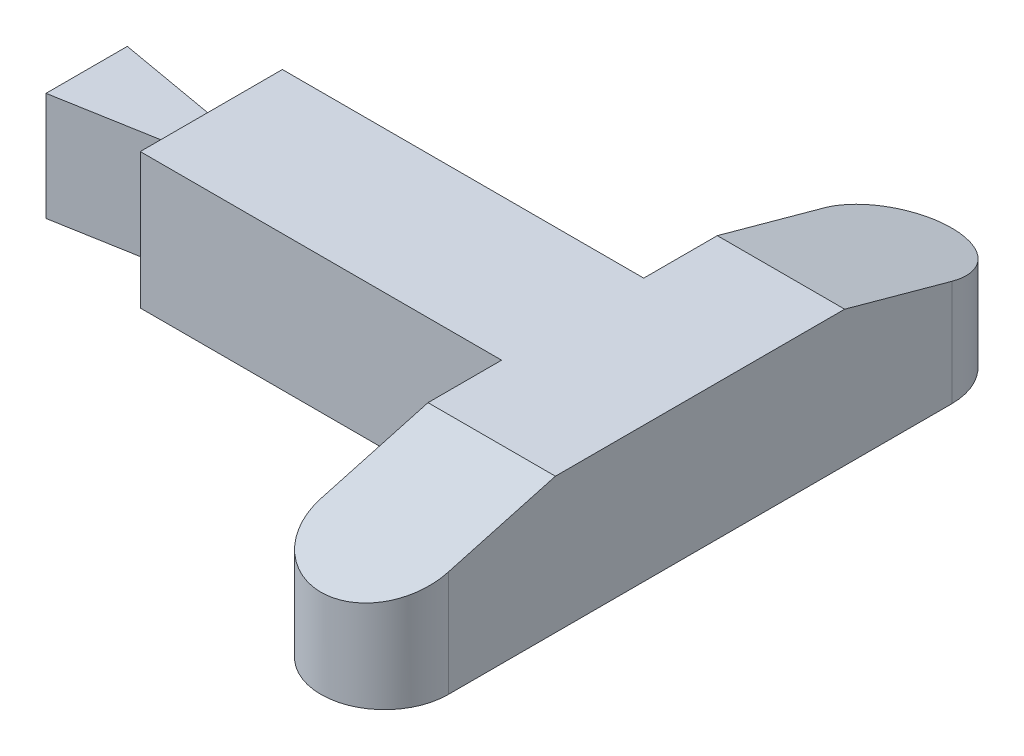
ISO-10303-21;
HEADER;
FILE_DESCRIPTION(('STEP AP214'),'2;1');
FILE_NAME('part.step','',(''),(''),'','','');
FILE_SCHEMA(('AUTOMOTIVE_DESIGN { 1 0 10303 214 1 1 1 1 }'));
ENDSEC;
DATA;
#1=APPLICATION_CONTEXT('core data for automotive mechanical design processes');
#2=APPLICATION_PROTOCOL_DEFINITION('international standard','automotive_design',2000,#1);
#3=PRODUCT_CONTEXT('',#1,'mechanical');
#4=PRODUCT('Part','Part','',(#3));
#5=PRODUCT_RELATED_PRODUCT_CATEGORY('part','',(#4));
#6=PRODUCT_DEFINITION_FORMATION('','',#4);
#7=PRODUCT_DEFINITION_CONTEXT('part definition',#1,'design');
#8=PRODUCT_DEFINITION('design','',#6,#7);
#9=PRODUCT_DEFINITION_SHAPE('','',#8);
#10=(LENGTH_UNIT() NAMED_UNIT(*) SI_UNIT(.MILLI.,.METRE.));
#11=(NAMED_UNIT(*) PLANE_ANGLE_UNIT() SI_UNIT($,.RADIAN.));
#12=(NAMED_UNIT(*) SI_UNIT($,.STERADIAN.) SOLID_ANGLE_UNIT());
#13=UNCERTAINTY_MEASURE_WITH_UNIT(LENGTH_MEASURE(1.E-05),#10,'distance_accuracy_value','');
#14=(GEOMETRIC_REPRESENTATION_CONTEXT(3) GLOBAL_UNCERTAINTY_ASSIGNED_CONTEXT((#13)) GLOBAL_UNIT_ASSIGNED_CONTEXT((#10,
#11,#12)) REPRESENTATION_CONTEXT('',''));
#15=CARTESIAN_POINT('',(0.,0.,0.));
#16=DIRECTION('',(0.,0.,1.));
#17=DIRECTION('',(1.,0.,0.));
#18=AXIS2_PLACEMENT_3D('',#15,#16,#17);
#19=CARTESIAN_POINT('',(136.652,38.1,-19.981386672207));
#20=DIRECTION('',(1.,0.,0.));
#21=DIRECTION('',(0.,0.,-1.));
#22=AXIS2_PLACEMENT_3D('',#19,#20,#21);
#23=PLANE('',#22);
#24=DIRECTION('',(0.,0.264986434589111,0.964252139994385));
#25=VECTOR('',#24,1.);
#26=CARTESIAN_POINT('',(136.652,38.1000000000001,-40.6688190452152));
#27=LINE('',#26,#25);
#28=CARTESIAN_POINT('',(136.652,29.8247557969159,-70.781386672207));
#29=VERTEX_POINT('',#28);
#30=CARTESIAN_POINT('',(136.652,38.1,-40.6688190452153));
#31=VERTEX_POINT('',#30);
#32=EDGE_CURVE('E317',#29,#31,#27,.T.);
#33=ORIENTED_EDGE('',*,*,#32,.F.);
#34=DIRECTION('',(0.,-1.,0.));
#35=VECTOR('',#34,1.);
#36=CARTESIAN_POINT('',(136.652,38.1,-70.781386672207));
#37=LINE('',#36,#35);
#38=CARTESIAN_POINT('',(136.652,0.,-70.781386672207));
#39=VERTEX_POINT('',#38);
#40=EDGE_CURVE('E253',#29,#39,#37,.T.);
#41=ORIENTED_EDGE('',*,*,#40,.T.);
#42=DIRECTION('',(0.,0.,1.));
#43=VECTOR('',#42,1.);
#44=CARTESIAN_POINT('',(136.652,0.,-19.981386672207));
#45=LINE('',#44,#43);
#46=CARTESIAN_POINT('',(136.652,0.,-19.981386672207));
#47=VERTEX_POINT('',#46);
#48=EDGE_CURVE('E233',#39,#47,#45,.T.);
#49=ORIENTED_EDGE('',*,*,#48,.T.);
#50=DIRECTION('',(0.,-1.,0.));
#51=VECTOR('',#50,1.);
#52=CARTESIAN_POINT('',(136.652,38.1,-19.981386672207));
#53=LINE('',#52,#51);
#54=CARTESIAN_POINT('',(136.652,38.1,-19.981386672207));
#55=VERTEX_POINT('',#54);
#56=EDGE_CURVE('E249',#55,#47,#53,.T.);
#57=ORIENTED_EDGE('',*,*,#56,.F.);
#58=DIRECTION('',(0.,0.,1.));
#59=VECTOR('',#58,1.);
#60=CARTESIAN_POINT('',(136.652,38.1,-19.981386672207));
#61=LINE('',#60,#59);
#62=EDGE_CURVE('E299',#31,#55,#61,.T.);
#63=ORIENTED_EDGE('',*,*,#62,.F.);
#64=EDGE_LOOP('',(#33,#41,#49,#57,#63));
#65=FACE_BOUND('',#64,.T.);
#66=ADVANCED_FACE('F45',(#65),#23,.F.);
#67=CARTESIAN_POINT('',(154.559,38.1,-70.781386672207));
#68=DIRECTION('',(0.,1.,0.));
#69=DIRECTION('',(0.,0.,1.));
#70=AXIS2_PLACEMENT_3D('',#67,#68,#69);
#71=PLANE('',#70);
#72=DIRECTION('',(-1.,0.,0.));
#73=VECTOR('',#72,1.);
#74=CARTESIAN_POINT('',(35.052,38.1,-19.981386672207));
#75=LINE('',#74,#73);
#76=CARTESIAN_POINT('',(35.052,38.1,-19.981386672207));
#77=VERTEX_POINT('',#76);
#78=EDGE_CURVE('E206',#55,#77,#75,.T.);
#79=ORIENTED_EDGE('',*,*,#78,.T.);
#80=DIRECTION('',(0.,0.,1.));
#81=VECTOR('',#80,1.);
#82=CARTESIAN_POINT('',(35.052,38.1,5.24938667220698));
#83=LINE('',#82,#81);
#84=CARTESIAN_POINT('',(35.052,38.1,19.981386672207));
#85=VERTEX_POINT('',#84);
#86=EDGE_CURVE('E242',#77,#85,#83,.T.);
#87=ORIENTED_EDGE('',*,*,#86,.T.);
#88=DIRECTION('',(1.,0.,0.));
#89=VECTOR('',#88,1.);
#90=CARTESIAN_POINT('',(35.052,38.1,19.981386672207));
#91=LINE('',#90,#89);
#92=CARTESIAN_POINT('',(136.652,38.1,19.981386672207));
#93=VERTEX_POINT('',#92);
#94=EDGE_CURVE('E293',#85,#93,#91,.T.);
#95=ORIENTED_EDGE('',*,*,#94,.T.);
#96=DIRECTION('',(0.,0.,1.));
#97=VECTOR('',#96,1.);
#98=CARTESIAN_POINT('',(136.652,38.1,19.981386672207));
#99=LINE('',#98,#97);
#100=CARTESIAN_POINT('',(136.652,38.1,40.6688190452152));
#101=VERTEX_POINT('',#100);
#102=EDGE_CURVE('E275',#93,#101,#99,.T.);
#103=ORIENTED_EDGE('',*,*,#102,.T.);
#104=DIRECTION('',(1.,0.,0.));
#105=VECTOR('',#104,1.);
#106=CARTESIAN_POINT('',(136.652,38.1,40.6688190452152));
#107=LINE('',#106,#105);
#108=CARTESIAN_POINT('',(172.466,38.1,40.6688190452151));
#109=VERTEX_POINT('',#108);
#110=EDGE_CURVE('E203',#101,#109,#107,.T.);
#111=ORIENTED_EDGE('',*,*,#110,.T.);
#112=DIRECTION('',(0.,0.,-1.));
#113=VECTOR('',#112,1.);
#114=CARTESIAN_POINT('',(172.466,38.1,-70.781386672207));
#115=LINE('',#114,#113);
#116=CARTESIAN_POINT('',(172.466,38.1,-40.6688190452154));
#117=VERTEX_POINT('',#116);
#118=EDGE_CURVE('E295',#109,#117,#115,.T.);
#119=ORIENTED_EDGE('',*,*,#118,.T.);
#120=DIRECTION('',(-1.,0.,0.));
#121=VECTOR('',#120,1.);
#122=CARTESIAN_POINT('',(530.129875813133,38.1,-40.6688190452154));
#123=LINE('',#122,#121);
#124=EDGE_CURVE('E61',#117,#31,#123,.T.);
#125=ORIENTED_EDGE('',*,*,#124,.T.);
#126=ORIENTED_EDGE('',*,*,#62,.T.);
#127=EDGE_LOOP('',(#79,#87,#95,#103,#111,#119,#125,#126));
#128=FACE_BOUND('',#127,.T.);
#129=ADVANCED_FACE('F292',(#128),#71,.T.);
#130=CARTESIAN_POINT('',(154.559,38.1,-70.781386672207));
#131=DIRECTION('',(0.,-1.,0.));
#132=DIRECTION('',(0.,0.,-1.));
#133=AXIS2_PLACEMENT_3D('',#130,#131,#132);
#134=CYLINDRICAL_SURFACE('',#133,17.907);
#135=ORIENTED_EDGE('',*,*,#40,.F.);
#136=CARTESIAN_POINT('',(154.559,29.8247557969159,-70.781386672207));
#137=DIRECTION('',(0.,0.964252139994385,-0.264986434589111));
#138=DIRECTION('',(0.,-0.264986434589111,-0.964252139994385));
#139=AXIS2_PLACEMENT_3D('',#136,#137,#138);
#140=ELLIPSE('',#139,18.570868818714,17.907);
#141=CARTESIAN_POINT('',(172.466,29.8247557969159,-70.781386672207));
#142=VERTEX_POINT('',#141);
#143=EDGE_CURVE('E11',#142,#29,#140,.T.);
#144=ORIENTED_EDGE('',*,*,#143,.F.);
#145=DIRECTION('',(0.,-1.,0.));
#146=VECTOR('',#145,1.);
#147=CARTESIAN_POINT('',(172.466,38.1,-70.781386672207));
#148=LINE('',#147,#146);
#149=CARTESIAN_POINT('',(172.466,0.,-70.781386672207));
#150=VERTEX_POINT('',#149);
#151=EDGE_CURVE('E256',#142,#150,#148,.T.);
#152=ORIENTED_EDGE('',*,*,#151,.T.);
#153=CARTESIAN_POINT('',(154.559,0.,-70.781386672207));
#154=DIRECTION('',(0.,1.,0.));
#155=DIRECTION('',(0.,0.,1.));
#156=AXIS2_PLACEMENT_3D('',#153,#154,#155);
#157=CIRCLE('',#156,17.907);
#158=EDGE_CURVE('E229',#150,#39,#157,.T.);
#159=ORIENTED_EDGE('',*,*,#158,.T.);
#160=EDGE_LOOP('',(#135,#144,#152,#159));
#161=FACE_BOUND('',#160,.T.);
#162=ADVANCED_FACE('F319',(#161),#134,.T.);
#163=CARTESIAN_POINT('',(136.652,38.1,19.981386672207));
#164=DIRECTION('',(1.,0.,0.));
#165=DIRECTION('',(0.,0.,-1.));
#166=AXIS2_PLACEMENT_3D('',#163,#164,#165);
#167=PLANE('',#166);
#168=DIRECTION('',(0.,-0.264986434589112,0.964252139994385));
#169=VECTOR('',#168,1.);
#170=CARTESIAN_POINT('',(136.652,38.1,40.6688190452152));
#171=LINE('',#170,#169);
#172=CARTESIAN_POINT('',(136.652,29.8247557969158,70.781386672207));
#173=VERTEX_POINT('',#172);
#174=EDGE_CURVE('E285',#101,#173,#171,.T.);
#175=ORIENTED_EDGE('',*,*,#174,.F.);
#176=ORIENTED_EDGE('',*,*,#102,.F.);
#177=DIRECTION('',(0.,-1.,0.));
#178=VECTOR('',#177,1.);
#179=CARTESIAN_POINT('',(136.652,38.1,19.981386672207));
#180=LINE('',#179,#178);
#181=CARTESIAN_POINT('',(136.652,0.,19.981386672207));
#182=VERTEX_POINT('',#181);
#183=EDGE_CURVE('E180',#93,#182,#180,.T.);
#184=ORIENTED_EDGE('',*,*,#183,.T.);
#185=DIRECTION('',(0.,0.,1.));
#186=VECTOR('',#185,1.);
#187=CARTESIAN_POINT('',(136.652,0.,19.981386672207));
#188=LINE('',#187,#186);
#189=CARTESIAN_POINT('',(136.652,0.,70.781386672207));
#190=VERTEX_POINT('',#189);
#191=EDGE_CURVE('E217',#182,#190,#188,.T.);
#192=ORIENTED_EDGE('',*,*,#191,.T.);
#193=DIRECTION('',(0.,-1.,0.));
#194=VECTOR('',#193,1.);
#195=CARTESIAN_POINT('',(136.652,38.1,70.781386672207));
#196=LINE('',#195,#194);
#197=EDGE_CURVE('E262',#173,#190,#196,.T.);
#198=ORIENTED_EDGE('',*,*,#197,.F.);
#199=EDGE_LOOP('',(#175,#176,#184,#192,#198));
#200=FACE_BOUND('',#199,.T.);
#201=ADVANCED_FACE('F271',(#200),#167,.F.);
#202=CARTESIAN_POINT('',(154.559,38.1,70.781386672207));
#203=DIRECTION('',(0.,-1.,0.));
#204=DIRECTION('',(0.,0.,-1.));
#205=AXIS2_PLACEMENT_3D('',#202,#203,#204);
#206=CYLINDRICAL_SURFACE('',#205,17.907);
#207=CARTESIAN_POINT('',(154.559,29.8247557969158,70.781386672207));
#208=DIRECTION('',(0.,0.964252139994385,0.264986434589112));
#209=DIRECTION('',(0.,-0.264986434589112,0.964252139994385));
#210=AXIS2_PLACEMENT_3D('',#207,#208,#209);
#211=ELLIPSE('',#210,18.5708688187141,17.907);
#212=CARTESIAN_POINT('',(172.466,29.8247557969158,70.781386672207));
#213=VERTEX_POINT('',#212);
#214=EDGE_CURVE('E200',#173,#213,#211,.T.);
#215=ORIENTED_EDGE('',*,*,#214,.F.);
#216=ORIENTED_EDGE('',*,*,#197,.T.);
#217=CARTESIAN_POINT('',(154.559,0.,70.781386672207));
#218=DIRECTION('',(0.,1.,0.));
#219=DIRECTION('',(0.,0.,-1.));
#220=AXIS2_PLACEMENT_3D('',#217,#218,#219);
#221=CIRCLE('',#220,17.907);
#222=CARTESIAN_POINT('',(172.466,0.,70.781386672207));
#223=VERTEX_POINT('',#222);
#224=EDGE_CURVE('E221',#190,#223,#221,.T.);
#225=ORIENTED_EDGE('',*,*,#224,.T.);
#226=DIRECTION('',(0.,-1.,0.));
#227=VECTOR('',#226,1.);
#228=CARTESIAN_POINT('',(172.466,38.1,70.781386672207));
#229=LINE('',#228,#227);
#230=EDGE_CURVE('E259',#213,#223,#229,.T.);
#231=ORIENTED_EDGE('',*,*,#230,.F.);
#232=EDGE_LOOP('',(#215,#216,#225,#231));
#233=FACE_BOUND('',#232,.T.);
#234=ADVANCED_FACE('F283',(#233),#206,.T.);
#235=CARTESIAN_POINT('',(172.466,38.1,-70.781386672207));
#236=DIRECTION('',(-1.,0.,0.));
#237=DIRECTION('',(0.,0.,1.));
#238=AXIS2_PLACEMENT_3D('',#235,#236,#237);
#239=PLANE('',#238);
#240=ORIENTED_EDGE('',*,*,#151,.F.);
#241=DIRECTION('',(0.,0.264986434589111,0.964252139994385));
#242=VECTOR('',#241,1.);
#243=CARTESIAN_POINT('',(172.466,38.1,-40.6688190452152));
#244=LINE('',#243,#242);
#245=EDGE_CURVE('E69',#142,#117,#244,.T.);
#246=ORIENTED_EDGE('',*,*,#245,.T.);
#247=ORIENTED_EDGE('',*,*,#118,.F.);
#248=DIRECTION('',(0.,-0.264986434589112,0.964252139994385));
#249=VECTOR('',#248,1.);
#250=CARTESIAN_POINT('',(172.466,38.1,40.6688190452152));
#251=LINE('',#250,#249);
#252=EDGE_CURVE('E288',#109,#213,#251,.T.);
#253=ORIENTED_EDGE('',*,*,#252,.T.);
#254=ORIENTED_EDGE('',*,*,#230,.T.);
#255=DIRECTION('',(0.,0.,-1.));
#256=VECTOR('',#255,1.);
#257=CARTESIAN_POINT('',(172.466,0.,-70.781386672207));
#258=LINE('',#257,#256);
#259=EDGE_CURVE('E225',#223,#150,#258,.T.);
#260=ORIENTED_EDGE('',*,*,#259,.T.);
#261=EDGE_LOOP('',(#240,#246,#247,#253,#254,#260));
#262=FACE_BOUND('',#261,.T.);
#263=ADVANCED_FACE('F320',(#262),#239,.F.);
#264=CARTESIAN_POINT('',(0.,38.1,-11.43));
#265=DIRECTION('',(-0.173648177666928,0.,0.984807753012209));
#266=DIRECTION('',(0.984807753012209,0.,0.173648177666928));
#267=AXIS2_PLACEMENT_3D('',#264,#265,#266);
#268=PLANE('',#267);
#269=DIRECTION('',(0.,-1.,0.));
#270=VECTOR('',#269,1.);
#271=CARTESIAN_POINT('',(0.,38.1,-11.43));
#272=LINE('',#271,#270);
#273=CARTESIAN_POINT('',(0.,30.48,-11.43));
#274=VERTEX_POINT('',#273);
#275=CARTESIAN_POINT('',(0.,0.,-11.43));
#276=VERTEX_POINT('',#275);
#277=EDGE_CURVE('E54',#274,#276,#272,.T.);
#278=ORIENTED_EDGE('',*,*,#277,.F.);
#279=DIRECTION('',(0.984807753012209,0.,0.173648177666928));
#280=VECTOR('',#279,1.);
#281=CARTESIAN_POINT('',(0.,30.48,-11.43));
#282=LINE('',#281,#280);
#283=CARTESIAN_POINT('',(35.052,30.48,-5.24938667220698));
#284=VERTEX_POINT('',#283);
#285=EDGE_CURVE('E332',#274,#284,#282,.T.);
#286=ORIENTED_EDGE('',*,*,#285,.T.);
#287=DIRECTION('',(0.,-1.,0.));
#288=VECTOR('',#287,1.);
#289=CARTESIAN_POINT('',(35.052,38.1,-5.24938667220698));
#290=LINE('',#289,#288);
#291=CARTESIAN_POINT('',(35.052,0.,-5.24938667220698));
#292=VERTEX_POINT('',#291);
#293=EDGE_CURVE('E154',#284,#292,#290,.T.);
#294=ORIENTED_EDGE('',*,*,#293,.T.);
#295=DIRECTION('',(-0.984807753012208,0.,-0.173648177666928));
#296=VECTOR('',#295,1.);
#297=CARTESIAN_POINT('',(0.,0.,-11.43));
#298=LINE('',#297,#296);
#299=EDGE_CURVE('E196',#292,#276,#298,.T.);
#300=ORIENTED_EDGE('',*,*,#299,.T.);
#301=EDGE_LOOP('',(#278,#286,#294,#300));
#302=FACE_BOUND('',#301,.T.);
#303=ADVANCED_FACE('F47',(#302),#268,.F.);
#304=CARTESIAN_POINT('',(0.,38.1,-11.43));
#305=DIRECTION('',(1.,0.,0.));
#306=DIRECTION('',(0.,0.,-1.));
#307=AXIS2_PLACEMENT_3D('',#304,#305,#306);
#308=PLANE('',#307);
#309=DIRECTION('',(0.,-1.,0.));
#310=VECTOR('',#309,1.);
#311=CARTESIAN_POINT('',(0.,38.1,11.43));
#312=LINE('',#311,#310);
#313=CARTESIAN_POINT('',(0.,30.48,11.43));
#314=VERTEX_POINT('',#313);
#315=CARTESIAN_POINT('',(0.,0.,11.43));
#316=VERTEX_POINT('',#315);
#317=EDGE_CURVE('E173',#314,#316,#312,.T.);
#318=ORIENTED_EDGE('',*,*,#317,.F.);
#319=DIRECTION('',(0.,0.,1.));
#320=VECTOR('',#319,1.);
#321=CARTESIAN_POINT('',(0.,30.48,11.43));
#322=LINE('',#321,#320);
#323=EDGE_CURVE('E158',#274,#314,#322,.T.);
#324=ORIENTED_EDGE('',*,*,#323,.F.);
#325=ORIENTED_EDGE('',*,*,#277,.T.);
#326=DIRECTION('',(0.,0.,1.));
#327=VECTOR('',#326,1.);
#328=CARTESIAN_POINT('',(0.,0.,-11.43));
#329=LINE('',#328,#327);
#330=EDGE_CURVE('E189',#276,#316,#329,.T.);
#331=ORIENTED_EDGE('',*,*,#330,.T.);
#332=EDGE_LOOP('',(#318,#324,#325,#331));
#333=FACE_BOUND('',#332,.T.);
#334=ADVANCED_FACE('F188',(#333),#308,.F.);
#335=CARTESIAN_POINT('',(0.,38.1,11.43));
#336=DIRECTION('',(-0.173648177666928,0.,-0.984807753012208));
#337=DIRECTION('',(-0.984807753012209,0.,0.173648177666928));
#338=AXIS2_PLACEMENT_3D('',#335,#336,#337);
#339=PLANE('',#338);
#340=DIRECTION('',(0.,-1.,0.));
#341=VECTOR('',#340,1.);
#342=CARTESIAN_POINT('',(35.052,38.1,5.24938667220698));
#343=LINE('',#342,#341);
#344=CARTESIAN_POINT('',(35.052,30.48,5.24938667220698));
#345=VERTEX_POINT('',#344);
#346=CARTESIAN_POINT('',(35.052,0.,5.24938667220698));
#347=VERTEX_POINT('',#346);
#348=EDGE_CURVE('E152',#345,#347,#343,.T.);
#349=ORIENTED_EDGE('',*,*,#348,.F.);
#350=DIRECTION('',(0.984807753012208,0.,-0.173648177666928));
#351=VECTOR('',#350,1.);
#352=CARTESIAN_POINT('',(35.052,30.48,5.24938667220698));
#353=LINE('',#352,#351);
#354=EDGE_CURVE('E159',#314,#345,#353,.T.);
#355=ORIENTED_EDGE('',*,*,#354,.F.);
#356=ORIENTED_EDGE('',*,*,#317,.T.);
#357=DIRECTION('',(0.984807753012208,0.,-0.173648177666928));
#358=VECTOR('',#357,1.);
#359=CARTESIAN_POINT('',(0.,0.,11.43));
#360=LINE('',#359,#358);
#361=EDGE_CURVE('E170',#316,#347,#360,.T.);
#362=ORIENTED_EDGE('',*,*,#361,.T.);
#363=EDGE_LOOP('',(#349,#355,#356,#362));
#364=FACE_BOUND('',#363,.T.);
#365=ADVANCED_FACE('F168',(#364),#339,.F.);
#366=CARTESIAN_POINT('',(35.052,38.1,19.981386672207));
#367=DIRECTION('',(0.,0.,-1.));
#368=DIRECTION('',(-1.,0.,0.));
#369=AXIS2_PLACEMENT_3D('',#366,#367,#368);
#370=PLANE('',#369);
#371=DIRECTION('',(1.,0.,0.));
#372=VECTOR('',#371,1.);
#373=CARTESIAN_POINT('',(35.052,0.,19.981386672207));
#374=LINE('',#373,#372);
#375=CARTESIAN_POINT('',(35.052,0.,19.981386672207));
#376=VERTEX_POINT('',#375);
#377=EDGE_CURVE('E214',#376,#182,#374,.T.);
#378=ORIENTED_EDGE('',*,*,#377,.T.);
#379=ORIENTED_EDGE('',*,*,#183,.F.);
#380=ORIENTED_EDGE('',*,*,#94,.F.);
#381=DIRECTION('',(0.,-1.,0.));
#382=VECTOR('',#381,1.);
#383=CARTESIAN_POINT('',(35.052,38.1,19.981386672207));
#384=LINE('',#383,#382);
#385=EDGE_CURVE('E174',#85,#376,#384,.T.);
#386=ORIENTED_EDGE('',*,*,#385,.T.);
#387=EDGE_LOOP('',(#378,#379,#380,#386));
#388=FACE_BOUND('',#387,.T.);
#389=ADVANCED_FACE('F366',(#388),#370,.F.);
#390=CARTESIAN_POINT('',(35.052,38.1,-19.981386672207));
#391=DIRECTION('',(0.,0.,1.));
#392=DIRECTION('',(1.,0.,0.));
#393=AXIS2_PLACEMENT_3D('',#390,#391,#392);
#394=PLANE('',#393);
#395=DIRECTION('',(-1.,0.,0.));
#396=VECTOR('',#395,1.);
#397=CARTESIAN_POINT('',(35.052,0.,-19.981386672207));
#398=LINE('',#397,#396);
#399=CARTESIAN_POINT('',(35.052,0.,-19.981386672207));
#400=VERTEX_POINT('',#399);
#401=EDGE_CURVE('E236',#47,#400,#398,.T.);
#402=ORIENTED_EDGE('',*,*,#401,.T.);
#403=DIRECTION('',(0.,-1.,0.));
#404=VECTOR('',#403,1.);
#405=CARTESIAN_POINT('',(35.052,38.1,-19.981386672207));
#406=LINE('',#405,#404);
#407=EDGE_CURVE('E245',#77,#400,#406,.T.);
#408=ORIENTED_EDGE('',*,*,#407,.F.);
#409=ORIENTED_EDGE('',*,*,#78,.F.);
#410=ORIENTED_EDGE('',*,*,#56,.T.);
#411=EDGE_LOOP('',(#402,#408,#409,#410));
#412=FACE_BOUND('',#411,.T.);
#413=ADVANCED_FACE('F310',(#412),#394,.F.);
#414=CARTESIAN_POINT('',(35.052,38.1,-5.24938667220698));
#415=DIRECTION('',(1.,0.,0.));
#416=DIRECTION('',(0.,0.,-1.));
#417=AXIS2_PLACEMENT_3D('',#414,#415,#416);
#418=PLANE('',#417);
#419=DIRECTION('',(0.,0.,1.));
#420=VECTOR('',#419,1.);
#421=CARTESIAN_POINT('',(35.052,0.,-5.24938667220698));
#422=LINE('',#421,#420);
#423=EDGE_CURVE('E239',#400,#292,#422,.T.);
#424=ORIENTED_EDGE('',*,*,#423,.T.);
#425=ORIENTED_EDGE('',*,*,#293,.F.);
#426=DIRECTION('',(0.,0.,-1.));
#427=VECTOR('',#426,1.);
#428=CARTESIAN_POINT('',(35.052,30.48,-5.24938667220698));
#429=LINE('',#428,#427);
#430=EDGE_CURVE('E147',#345,#284,#429,.T.);
#431=ORIENTED_EDGE('',*,*,#430,.F.);
#432=ORIENTED_EDGE('',*,*,#348,.T.);
#433=DIRECTION('',(0.,0.,1.));
#434=VECTOR('',#433,1.);
#435=CARTESIAN_POINT('',(35.052,0.,5.24938667220698));
#436=LINE('',#435,#434);
#437=EDGE_CURVE('E211',#347,#376,#436,.T.);
#438=ORIENTED_EDGE('',*,*,#437,.T.);
#439=ORIENTED_EDGE('',*,*,#385,.F.);
#440=ORIENTED_EDGE('',*,*,#86,.F.);
#441=ORIENTED_EDGE('',*,*,#407,.T.);
#442=EDGE_LOOP('',(#424,#425,#431,#432,#438,#439,#440,#441));
#443=FACE_BOUND('',#442,.T.);
#444=ADVANCED_FACE('F150',(#443),#418,.F.);
#445=CARTESIAN_POINT('',(154.559,0.,-70.781386672207));
#446=DIRECTION('',(0.,1.,0.));
#447=DIRECTION('',(0.,0.,1.));
#448=AXIS2_PLACEMENT_3D('',#445,#446,#447);
#449=PLANE('',#448);
#450=ORIENTED_EDGE('',*,*,#299,.F.);
#451=ORIENTED_EDGE('',*,*,#423,.F.);
#452=ORIENTED_EDGE('',*,*,#401,.F.);
#453=ORIENTED_EDGE('',*,*,#48,.F.);
#454=ORIENTED_EDGE('',*,*,#158,.F.);
#455=ORIENTED_EDGE('',*,*,#259,.F.);
#456=ORIENTED_EDGE('',*,*,#224,.F.);
#457=ORIENTED_EDGE('',*,*,#191,.F.);
#458=ORIENTED_EDGE('',*,*,#377,.F.);
#459=ORIENTED_EDGE('',*,*,#437,.F.);
#460=ORIENTED_EDGE('',*,*,#361,.F.);
#461=ORIENTED_EDGE('',*,*,#330,.F.);
#462=EDGE_LOOP('',(#450,#451,#452,#453,#454,#455,#456,#457,#458,#459,#460,#461));
#463=FACE_BOUND('',#462,.T.);
#464=ADVANCED_FACE('F194',(#463),#449,.F.);
#465=CARTESIAN_POINT('',(136.652,38.1,40.6688190452152));
#466=DIRECTION('',(0.,0.964252139994385,0.264986434589112));
#467=DIRECTION('',(0.,-0.264986434589112,0.964252139994385));
#468=AXIS2_PLACEMENT_3D('',#465,#466,#467);
#469=PLANE('',#468);
#470=ORIENTED_EDGE('',*,*,#214,.T.);
#471=ORIENTED_EDGE('',*,*,#252,.F.);
#472=ORIENTED_EDGE('',*,*,#110,.F.);
#473=ORIENTED_EDGE('',*,*,#174,.T.);
#474=EDGE_LOOP('',(#470,#471,#472,#473));
#475=FACE_BOUND('',#474,.T.);
#476=ADVANCED_FACE('F341',(#475),#469,.T.);
#477=CARTESIAN_POINT('',(530.129875813133,38.1,-40.6688190452154));
#478=DIRECTION('',(0.,0.964252139994385,-0.264986434589111));
#479=DIRECTION('',(0.,0.264986434589111,0.964252139994385));
#480=AXIS2_PLACEMENT_3D('',#477,#478,#479);
#481=PLANE('',#480);
#482=ORIENTED_EDGE('',*,*,#143,.T.);
#483=ORIENTED_EDGE('',*,*,#32,.T.);
#484=ORIENTED_EDGE('',*,*,#124,.F.);
#485=ORIENTED_EDGE('',*,*,#245,.F.);
#486=EDGE_LOOP('',(#482,#483,#484,#485));
#487=FACE_BOUND('',#486,.T.);
#488=ADVANCED_FACE('F339',(#487),#481,.T.);
#489=CARTESIAN_POINT('',(0.,30.48,0.));
#490=DIRECTION('',(0.,-1.,0.));
#491=DIRECTION('',(0.,0.,-1.));
#492=AXIS2_PLACEMENT_3D('',#489,#490,#491);
#493=PLANE('',#492);
#494=ORIENTED_EDGE('',*,*,#323,.T.);
#495=ORIENTED_EDGE('',*,*,#354,.T.);
#496=ORIENTED_EDGE('',*,*,#430,.T.);
#497=ORIENTED_EDGE('',*,*,#285,.F.);
#498=EDGE_LOOP('',(#494,#495,#496,#497));
#499=FACE_BOUND('',#498,.T.);
#500=ADVANCED_FACE('F162',(#499),#493,.F.);
#501=CLOSED_SHELL('',(#66,#129,#162,#201,#234,#263,#303,#334,#365,#389,#413,#444,#464,#476,#488,#500));
#502=MANIFOLD_SOLID_BREP('B2',#501);
#503=ADVANCED_BREP_SHAPE_REPRESENTATION('',(#18,#502),#14);
#504=SHAPE_DEFINITION_REPRESENTATION(#9,#503);
ENDSEC;
END-ISO-10303-21;
